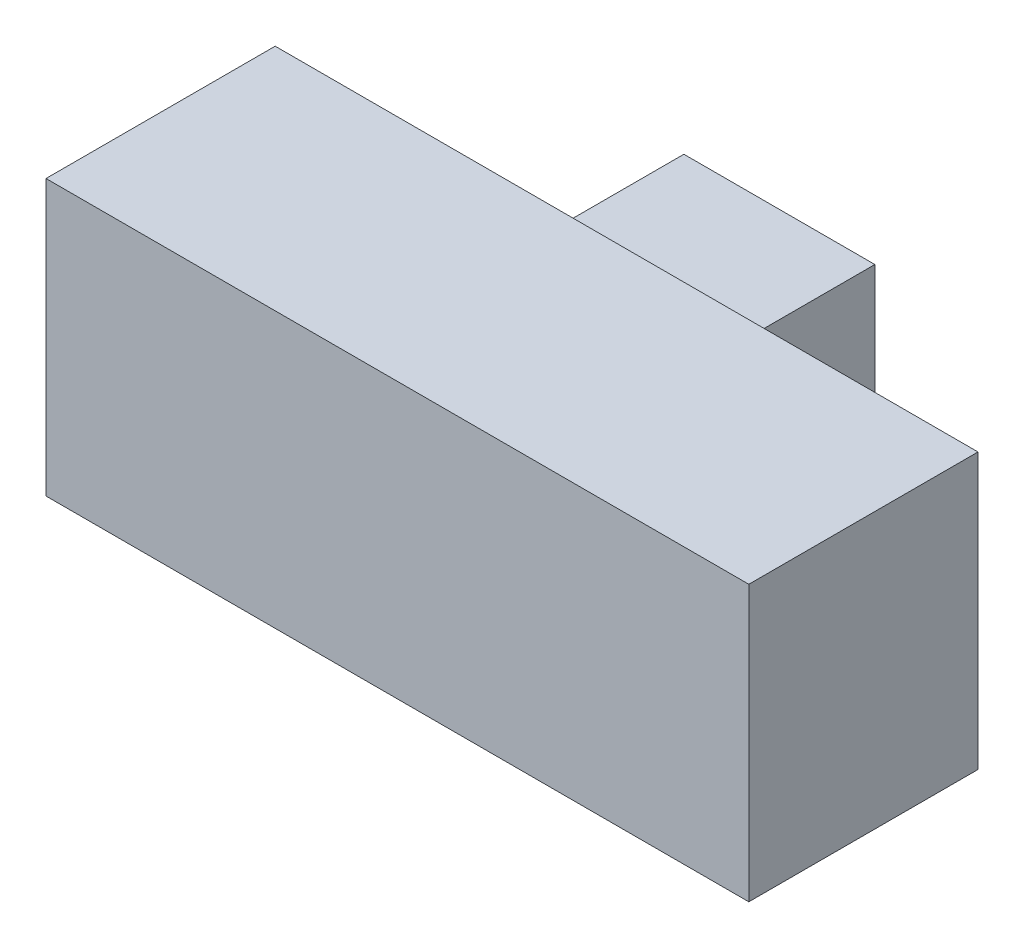
ISO-10303-21;
HEADER;
FILE_DESCRIPTION(('STEP AP214'),'2;1');
FILE_NAME('part.step','',(''),(''),'','','');
FILE_SCHEMA(('AUTOMOTIVE_DESIGN { 1 0 10303 214 1 1 1 1 }'));
ENDSEC;
DATA;
#1=APPLICATION_CONTEXT('core data for automotive mechanical design processes');
#2=APPLICATION_PROTOCOL_DEFINITION('international standard','automotive_design',2000,#1);
#3=PRODUCT_CONTEXT('',#1,'mechanical');
#4=PRODUCT('Part','Part','',(#3));
#5=PRODUCT_RELATED_PRODUCT_CATEGORY('part','',(#4));
#6=PRODUCT_DEFINITION_FORMATION('','',#4);
#7=PRODUCT_DEFINITION_CONTEXT('part definition',#1,'design');
#8=PRODUCT_DEFINITION('design','',#6,#7);
#9=PRODUCT_DEFINITION_SHAPE('','',#8);
#10=(LENGTH_UNIT() NAMED_UNIT(*) SI_UNIT(.MILLI.,.METRE.));
#11=(NAMED_UNIT(*) PLANE_ANGLE_UNIT() SI_UNIT($,.RADIAN.));
#12=(NAMED_UNIT(*) SI_UNIT($,.STERADIAN.) SOLID_ANGLE_UNIT());
#13=UNCERTAINTY_MEASURE_WITH_UNIT(LENGTH_MEASURE(1.E-05),#10,'distance_accuracy_value','');
#14=(GEOMETRIC_REPRESENTATION_CONTEXT(3) GLOBAL_UNCERTAINTY_ASSIGNED_CONTEXT((#13)) GLOBAL_UNIT_ASSIGNED_CONTEXT((#10,
#11,#12)) REPRESENTATION_CONTEXT('',''));
#15=CARTESIAN_POINT('',(0.,0.,0.));
#16=DIRECTION('',(0.,0.,1.));
#17=DIRECTION('',(1.,0.,0.));
#18=AXIS2_PLACEMENT_3D('',#15,#16,#17);
#19=CARTESIAN_POINT('',(0.,0.,0.));
#20=DIRECTION('',(0.,0.,1.));
#21=DIRECTION('',(1.,0.,0.));
#22=AXIS2_PLACEMENT_3D('',#19,#20,#21);
#23=PLANE('',#22);
#24=DIRECTION('',(0.,1.,0.));
#25=VECTOR('',#24,1.);
#26=CARTESIAN_POINT('',(4.6,1.8,0.));
#27=LINE('',#26,#25);
#28=CARTESIAN_POINT('',(4.6,-1.8,0.));
#29=VERTEX_POINT('',#28);
#30=CARTESIAN_POINT('',(4.6,1.8,0.));
#31=VERTEX_POINT('',#30);
#32=EDGE_CURVE('E118',#29,#31,#27,.T.);
#33=ORIENTED_EDGE('',*,*,#32,.F.);
#34=DIRECTION('',(1.,0.,0.));
#35=VECTOR('',#34,1.);
#36=CARTESIAN_POINT('',(-4.6,-1.8,0.));
#37=LINE('',#36,#35);
#38=CARTESIAN_POINT('',(-4.6,-1.8,0.));
#39=VERTEX_POINT('',#38);
#40=EDGE_CURVE('E131',#39,#29,#37,.T.);
#41=ORIENTED_EDGE('',*,*,#40,.F.);
#42=DIRECTION('',(0.,-1.,0.));
#43=VECTOR('',#42,1.);
#44=CARTESIAN_POINT('',(-4.6,1.8,0.));
#45=LINE('',#44,#43);
#46=CARTESIAN_POINT('',(-4.6,1.8,0.));
#47=VERTEX_POINT('',#46);
#48=EDGE_CURVE('E139',#47,#39,#45,.T.);
#49=ORIENTED_EDGE('',*,*,#48,.F.);
#50=DIRECTION('',(-1.,0.,0.));
#51=VECTOR('',#50,1.);
#52=CARTESIAN_POINT('',(-4.6,1.8,0.));
#53=LINE('',#52,#51);
#54=EDGE_CURVE('E121',#31,#47,#53,.T.);
#55=ORIENTED_EDGE('',*,*,#54,.F.);
#56=EDGE_LOOP('',(#33,#41,#49,#55));
#57=FACE_BOUND('',#56,.T.);
#58=DIRECTION('',(0.,-1.,0.));
#59=VECTOR('',#58,1.);
#60=CARTESIAN_POINT('',(1.25,1.25,0.));
#61=LINE('',#60,#59);
#62=CARTESIAN_POINT('',(1.25,1.25,0.));
#63=VERTEX_POINT('',#62);
#64=CARTESIAN_POINT('',(1.25,-1.25,0.));
#65=VERTEX_POINT('',#64);
#66=EDGE_CURVE('E48',#63,#65,#61,.T.);
#67=ORIENTED_EDGE('',*,*,#66,.F.);
#68=DIRECTION('',(1.,0.,0.));
#69=VECTOR('',#68,1.);
#70=CARTESIAN_POINT('',(-1.25,1.25,0.));
#71=LINE('',#70,#69);
#72=CARTESIAN_POINT('',(-1.25,1.25,0.));
#73=VERTEX_POINT('',#72);
#74=EDGE_CURVE('E52',#73,#63,#71,.T.);
#75=ORIENTED_EDGE('',*,*,#74,.F.);
#76=DIRECTION('',(0.,1.,0.));
#77=VECTOR('',#76,1.);
#78=CARTESIAN_POINT('',(-1.25,1.25,0.));
#79=LINE('',#78,#77);
#80=CARTESIAN_POINT('',(-1.25,-1.25,0.));
#81=VERTEX_POINT('',#80);
#82=EDGE_CURVE('E260',#81,#73,#79,.T.);
#83=ORIENTED_EDGE('',*,*,#82,.F.);
#84=DIRECTION('',(-1.,0.,0.));
#85=VECTOR('',#84,1.);
#86=CARTESIAN_POINT('',(-1.25,-1.25,0.));
#87=LINE('',#86,#85);
#88=EDGE_CURVE('E266',#65,#81,#87,.T.);
#89=ORIENTED_EDGE('',*,*,#88,.F.);
#90=EDGE_LOOP('',(#67,#75,#83,#89));
#91=FACE_BOUND('',#90,.T.);
#92=ADVANCED_FACE('F33',(#57,#91),#23,.F.);
#93=CARTESIAN_POINT('',(4.6,1.8,3.));
#94=DIRECTION('',(-1.,0.,0.));
#95=DIRECTION('',(0.,-1.,0.));
#96=AXIS2_PLACEMENT_3D('',#93,#94,#95);
#97=PLANE('',#96);
#98=ORIENTED_EDGE('',*,*,#32,.T.);
#99=DIRECTION('',(0.,0.,-1.));
#100=VECTOR('',#99,1.);
#101=CARTESIAN_POINT('',(4.6,1.8,3.));
#102=LINE('',#101,#100);
#103=CARTESIAN_POINT('',(4.6,1.8,3.));
#104=VERTEX_POINT('',#103);
#105=EDGE_CURVE('E11',#104,#31,#102,.T.);
#106=ORIENTED_EDGE('',*,*,#105,.F.);
#107=DIRECTION('',(0.,1.,0.));
#108=VECTOR('',#107,1.);
#109=CARTESIAN_POINT('',(4.6,1.8,3.));
#110=LINE('',#109,#108);
#111=CARTESIAN_POINT('',(4.6,-1.8,3.));
#112=VERTEX_POINT('',#111);
#113=EDGE_CURVE('E127',#112,#104,#110,.T.);
#114=ORIENTED_EDGE('',*,*,#113,.F.);
#115=DIRECTION('',(0.,0.,-1.));
#116=VECTOR('',#115,1.);
#117=CARTESIAN_POINT('',(4.6,-1.8,3.));
#118=LINE('',#117,#116);
#119=EDGE_CURVE('E136',#112,#29,#118,.T.);
#120=ORIENTED_EDGE('',*,*,#119,.T.);
#121=EDGE_LOOP('',(#98,#106,#114,#120));
#122=FACE_BOUND('',#121,.T.);
#123=ADVANCED_FACE('F35',(#122),#97,.F.);
#124=CARTESIAN_POINT('',(-4.6,1.8,3.));
#125=DIRECTION('',(0.,-1.,0.));
#126=DIRECTION('',(0.,0.,-1.));
#127=AXIS2_PLACEMENT_3D('',#124,#125,#126);
#128=PLANE('',#127);
#129=ORIENTED_EDGE('',*,*,#54,.T.);
#130=DIRECTION('',(0.,0.,-1.));
#131=VECTOR('',#130,1.);
#132=CARTESIAN_POINT('',(-4.6,1.8,3.));
#133=LINE('',#132,#131);
#134=CARTESIAN_POINT('',(-4.6,1.8,3.));
#135=VERTEX_POINT('',#134);
#136=EDGE_CURVE('E41',#135,#47,#133,.T.);
#137=ORIENTED_EDGE('',*,*,#136,.F.);
#138=DIRECTION('',(-1.,0.,0.));
#139=VECTOR('',#138,1.);
#140=CARTESIAN_POINT('',(-4.6,1.8,3.));
#141=LINE('',#140,#139);
#142=EDGE_CURVE('E130',#104,#135,#141,.T.);
#143=ORIENTED_EDGE('',*,*,#142,.F.);
#144=ORIENTED_EDGE('',*,*,#105,.T.);
#145=EDGE_LOOP('',(#129,#137,#143,#144));
#146=FACE_BOUND('',#145,.T.);
#147=ADVANCED_FACE('F166',(#146),#128,.F.);
#148=CARTESIAN_POINT('',(-4.6,1.8,3.));
#149=DIRECTION('',(1.,0.,0.));
#150=DIRECTION('',(0.,1.,0.));
#151=AXIS2_PLACEMENT_3D('',#148,#149,#150);
#152=PLANE('',#151);
#153=ORIENTED_EDGE('',*,*,#48,.T.);
#154=DIRECTION('',(0.,0.,-1.));
#155=VECTOR('',#154,1.);
#156=CARTESIAN_POINT('',(-4.6,-1.8,3.));
#157=LINE('',#156,#155);
#158=CARTESIAN_POINT('',(-4.6,-1.8,3.));
#159=VERTEX_POINT('',#158);
#160=EDGE_CURVE('E144',#159,#39,#157,.T.);
#161=ORIENTED_EDGE('',*,*,#160,.F.);
#162=DIRECTION('',(0.,-1.,0.));
#163=VECTOR('',#162,1.);
#164=CARTESIAN_POINT('',(-4.6,1.8,3.));
#165=LINE('',#164,#163);
#166=EDGE_CURVE('E133',#135,#159,#165,.T.);
#167=ORIENTED_EDGE('',*,*,#166,.F.);
#168=ORIENTED_EDGE('',*,*,#136,.T.);
#169=EDGE_LOOP('',(#153,#161,#167,#168));
#170=FACE_BOUND('',#169,.T.);
#171=ADVANCED_FACE('F151',(#170),#152,.F.);
#172=CARTESIAN_POINT('',(-4.6,-1.8,3.));
#173=DIRECTION('',(0.,1.,0.));
#174=DIRECTION('',(0.,0.,1.));
#175=AXIS2_PLACEMENT_3D('',#172,#173,#174);
#176=PLANE('',#175);
#177=ORIENTED_EDGE('',*,*,#40,.T.);
#178=ORIENTED_EDGE('',*,*,#119,.F.);
#179=DIRECTION('',(1.,0.,0.));
#180=VECTOR('',#179,1.);
#181=CARTESIAN_POINT('',(-4.6,-1.8,3.));
#182=LINE('',#181,#180);
#183=EDGE_CURVE('E135',#159,#112,#182,.T.);
#184=ORIENTED_EDGE('',*,*,#183,.F.);
#185=ORIENTED_EDGE('',*,*,#160,.T.);
#186=EDGE_LOOP('',(#177,#178,#184,#185));
#187=FACE_BOUND('',#186,.T.);
#188=ADVANCED_FACE('F159',(#187),#176,.F.);
#189=CARTESIAN_POINT('',(0.,0.,3.));
#190=DIRECTION('',(0.,0.,1.));
#191=DIRECTION('',(1.,0.,0.));
#192=AXIS2_PLACEMENT_3D('',#189,#190,#191);
#193=PLANE('',#192);
#194=ORIENTED_EDGE('',*,*,#113,.T.);
#195=ORIENTED_EDGE('',*,*,#142,.T.);
#196=ORIENTED_EDGE('',*,*,#166,.T.);
#197=ORIENTED_EDGE('',*,*,#183,.T.);
#198=EDGE_LOOP('',(#194,#195,#196,#197));
#199=FACE_BOUND('',#198,.T.);
#200=ADVANCED_FACE('F165',(#199),#193,.T.);
#201=CARTESIAN_POINT('',(1.25,1.25,-2.));
#202=DIRECTION('',(-1.,0.,0.));
#203=DIRECTION('',(0.,0.,1.));
#204=AXIS2_PLACEMENT_3D('',#201,#202,#203);
#205=PLANE('',#204);
#206=ORIENTED_EDGE('',*,*,#66,.T.);
#207=DIRECTION('',(0.,0.,1.));
#208=VECTOR('',#207,1.);
#209=CARTESIAN_POINT('',(1.25,-1.25,-2.));
#210=LINE('',#209,#208);
#211=CARTESIAN_POINT('',(1.25,-1.25,-2.));
#212=VERTEX_POINT('',#211);
#213=EDGE_CURVE('E101',#212,#65,#210,.T.);
#214=ORIENTED_EDGE('',*,*,#213,.F.);
#215=DIRECTION('',(0.,-1.,0.));
#216=VECTOR('',#215,1.);
#217=CARTESIAN_POINT('',(1.25,1.25,-2.));
#218=LINE('',#217,#216);
#219=CARTESIAN_POINT('',(1.25,1.25,-2.));
#220=VERTEX_POINT('',#219);
#221=EDGE_CURVE('E107',#220,#212,#218,.T.);
#222=ORIENTED_EDGE('',*,*,#221,.F.);
#223=DIRECTION('',(0.,0.,1.));
#224=VECTOR('',#223,1.);
#225=CARTESIAN_POINT('',(1.25,1.25,-2.));
#226=LINE('',#225,#224);
#227=EDGE_CURVE('E258',#220,#63,#226,.T.);
#228=ORIENTED_EDGE('',*,*,#227,.T.);
#229=EDGE_LOOP('',(#206,#214,#222,#228));
#230=FACE_BOUND('',#229,.T.);
#231=ADVANCED_FACE('F117',(#230),#205,.F.);
#232=CARTESIAN_POINT('',(-1.25,-1.25,-2.));
#233=DIRECTION('',(0.,1.,0.));
#234=DIRECTION('',(-1.,0.,0.));
#235=AXIS2_PLACEMENT_3D('',#232,#233,#234);
#236=PLANE('',#235);
#237=ORIENTED_EDGE('',*,*,#88,.T.);
#238=DIRECTION('',(0.,0.,1.));
#239=VECTOR('',#238,1.);
#240=CARTESIAN_POINT('',(-1.25,-1.25,-2.));
#241=LINE('',#240,#239);
#242=CARTESIAN_POINT('',(-1.25,-1.25,-2.));
#243=VERTEX_POINT('',#242);
#244=EDGE_CURVE('E103',#243,#81,#241,.T.);
#245=ORIENTED_EDGE('',*,*,#244,.F.);
#246=DIRECTION('',(-1.,0.,0.));
#247=VECTOR('',#246,1.);
#248=CARTESIAN_POINT('',(-1.25,-1.25,-2.));
#249=LINE('',#248,#247);
#250=EDGE_CURVE('E96',#212,#243,#249,.T.);
#251=ORIENTED_EDGE('',*,*,#250,.F.);
#252=ORIENTED_EDGE('',*,*,#213,.T.);
#253=EDGE_LOOP('',(#237,#245,#251,#252));
#254=FACE_BOUND('',#253,.T.);
#255=ADVANCED_FACE('F99',(#254),#236,.F.);
#256=CARTESIAN_POINT('',(-1.25,1.25,-2.));
#257=DIRECTION('',(1.,0.,0.));
#258=DIRECTION('',(0.,0.,-1.));
#259=AXIS2_PLACEMENT_3D('',#256,#257,#258);
#260=PLANE('',#259);
#261=ORIENTED_EDGE('',*,*,#82,.T.);
#262=DIRECTION('',(0.,0.,1.));
#263=VECTOR('',#262,1.);
#264=CARTESIAN_POINT('',(-1.25,1.25,-2.));
#265=LINE('',#264,#263);
#266=CARTESIAN_POINT('',(-1.25,1.25,-2.));
#267=VERTEX_POINT('',#266);
#268=EDGE_CURVE('E123',#267,#73,#265,.T.);
#269=ORIENTED_EDGE('',*,*,#268,.F.);
#270=DIRECTION('',(0.,1.,0.));
#271=VECTOR('',#270,1.);
#272=CARTESIAN_POINT('',(-1.25,1.25,-2.));
#273=LINE('',#272,#271);
#274=EDGE_CURVE('E106',#243,#267,#273,.T.);
#275=ORIENTED_EDGE('',*,*,#274,.F.);
#276=ORIENTED_EDGE('',*,*,#244,.T.);
#277=EDGE_LOOP('',(#261,#269,#275,#276));
#278=FACE_BOUND('',#277,.T.);
#279=ADVANCED_FACE('F190',(#278),#260,.F.);
#280=CARTESIAN_POINT('',(-1.25,1.25,-2.));
#281=DIRECTION('',(0.,-1.,0.));
#282=DIRECTION('',(1.,0.,0.));
#283=AXIS2_PLACEMENT_3D('',#280,#281,#282);
#284=PLANE('',#283);
#285=ORIENTED_EDGE('',*,*,#74,.T.);
#286=ORIENTED_EDGE('',*,*,#227,.F.);
#287=DIRECTION('',(1.,0.,0.));
#288=VECTOR('',#287,1.);
#289=CARTESIAN_POINT('',(-1.25,1.25,-2.));
#290=LINE('',#289,#288);
#291=EDGE_CURVE('E112',#267,#220,#290,.T.);
#292=ORIENTED_EDGE('',*,*,#291,.F.);
#293=ORIENTED_EDGE('',*,*,#268,.T.);
#294=EDGE_LOOP('',(#285,#286,#292,#293));
#295=FACE_BOUND('',#294,.T.);
#296=ADVANCED_FACE('F195',(#295),#284,.F.);
#297=CARTESIAN_POINT('',(0.,0.,-2.));
#298=DIRECTION('',(0.,0.,1.));
#299=DIRECTION('',(1.,0.,0.));
#300=AXIS2_PLACEMENT_3D('',#297,#298,#299);
#301=PLANE('',#300);
#302=ORIENTED_EDGE('',*,*,#221,.T.);
#303=ORIENTED_EDGE('',*,*,#250,.T.);
#304=ORIENTED_EDGE('',*,*,#274,.T.);
#305=ORIENTED_EDGE('',*,*,#291,.T.);
#306=EDGE_LOOP('',(#302,#303,#304,#305));
#307=FACE_BOUND('',#306,.T.);
#308=ADVANCED_FACE('F110',(#307),#301,.F.);
#309=CLOSED_SHELL('',(#92,#123,#147,#171,#188,#200,#231,#255,#279,#296,#308));
#310=MANIFOLD_SOLID_BREP('B2',#309);
#311=ADVANCED_BREP_SHAPE_REPRESENTATION('',(#18,#310),#14);
#312=SHAPE_DEFINITION_REPRESENTATION(#9,#311);
ENDSEC;
END-ISO-10303-21;
